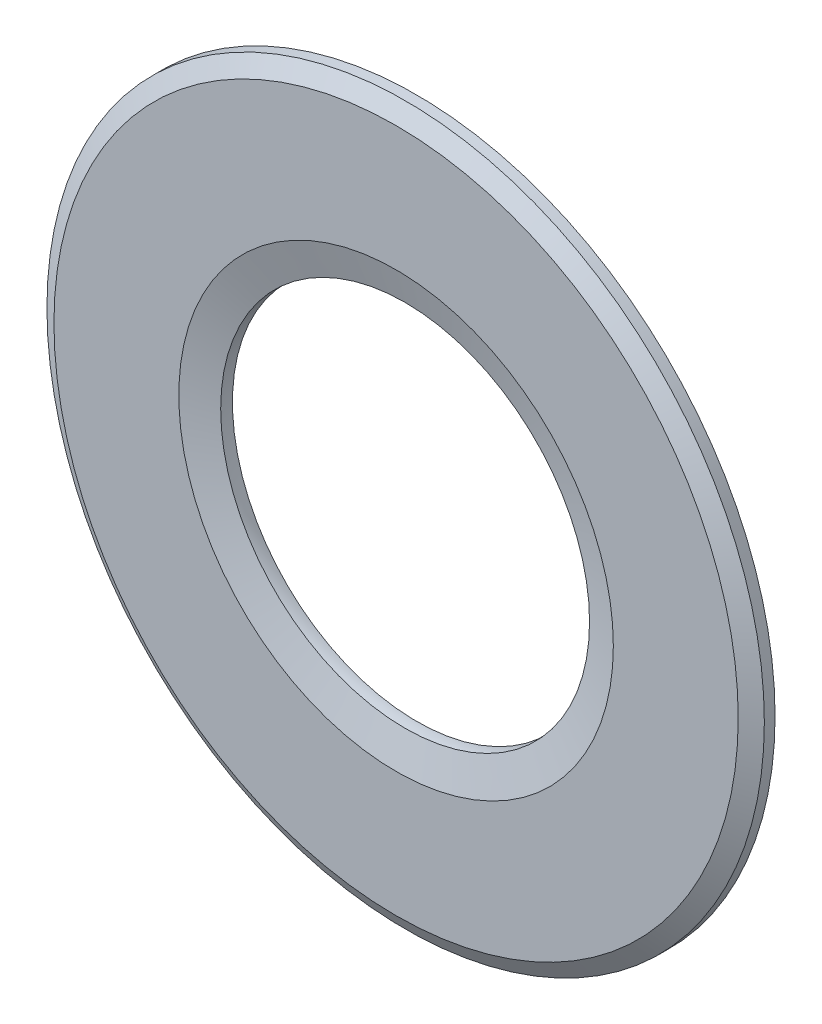
ISO-10303-21;
HEADER;
FILE_DESCRIPTION(('STEP AP214'),'2;1');
FILE_NAME('part.step','',(''),(''),'','','');
FILE_SCHEMA(('AUTOMOTIVE_DESIGN { 1 0 10303 214 1 1 1 1 }'));
ENDSEC;
DATA;
#1=APPLICATION_CONTEXT('core data for automotive mechanical design processes');
#2=APPLICATION_PROTOCOL_DEFINITION('international standard','automotive_design',2000,#1);
#3=PRODUCT_CONTEXT('',#1,'mechanical');
#4=PRODUCT('Part','Part','',(#3));
#5=PRODUCT_RELATED_PRODUCT_CATEGORY('part','',(#4));
#6=PRODUCT_DEFINITION_FORMATION('','',#4);
#7=PRODUCT_DEFINITION_CONTEXT('part definition',#1,'design');
#8=PRODUCT_DEFINITION('design','',#6,#7);
#9=PRODUCT_DEFINITION_SHAPE('','',#8);
#10=(LENGTH_UNIT() NAMED_UNIT(*) SI_UNIT(.MILLI.,.METRE.));
#11=(NAMED_UNIT(*) PLANE_ANGLE_UNIT() SI_UNIT($,.RADIAN.));
#12=(NAMED_UNIT(*) SI_UNIT($,.STERADIAN.) SOLID_ANGLE_UNIT());
#13=UNCERTAINTY_MEASURE_WITH_UNIT(LENGTH_MEASURE(1.E-05),#10,'distance_accuracy_value','');
#14=(GEOMETRIC_REPRESENTATION_CONTEXT(3) GLOBAL_UNCERTAINTY_ASSIGNED_CONTEXT((#13)) GLOBAL_UNIT_ASSIGNED_CONTEXT((#10,
#11,#12)) REPRESENTATION_CONTEXT('',''));
#15=CARTESIAN_POINT('',(0.,0.,0.));
#16=DIRECTION('',(0.,0.,1.));
#17=DIRECTION('',(1.,0.,0.));
#18=AXIS2_PLACEMENT_3D('',#15,#16,#17);
#19=CARTESIAN_POINT('',(0.,0.,0.396239999999998));
#20=DIRECTION('',(0.,0.,1.));
#21=DIRECTION('',(1.,0.,0.));
#22=AXIS2_PLACEMENT_3D('',#19,#20,#21);
#23=PLANE('',#22);
#24=CARTESIAN_POINT('',(0.,0.,0.396239999999998));
#25=DIRECTION('',(0.,0.,1.));
#26=DIRECTION('',(1.,0.,0.));
#27=AXIS2_PLACEMENT_3D('',#24,#25,#26);
#28=CIRCLE('',#27,5.76924391946965);
#29=CARTESIAN_POINT('',(5.76924391946965,0.,0.396239999999998));
#30=VERTEX_POINT('',#29);
#31=EDGE_CURVE('E10',#30,#30,#28,.F.);
#32=ORIENTED_EDGE('',*,*,#31,.T.);
#33=EDGE_LOOP('',(#32));
#34=FACE_BOUND('',#33,.T.);
#35=CARTESIAN_POINT('',(0.,0.,0.396239999999998));
#36=DIRECTION('',(0.,0.,1.));
#37=DIRECTION('',(1.,0.,0.));
#38=AXIS2_PLACEMENT_3D('',#35,#36,#37);
#39=CIRCLE('',#38,9.08505909487751);
#40=CARTESIAN_POINT('',(9.08505909487751,0.,0.396239999999998));
#41=VERTEX_POINT('',#40);
#42=EDGE_CURVE('E75',#41,#41,#39,.T.);
#43=ORIENTED_EDGE('',*,*,#42,.T.);
#44=EDGE_LOOP('',(#43));
#45=FACE_BOUND('',#44,.T.);
#46=ADVANCED_FACE('F49',(#34,#45),#23,.T.);
#47=CARTESIAN_POINT('',(0.,0.,0.396239999999998));
#48=DIRECTION('',(0.,0.,-1.));
#49=DIRECTION('',(-1.,0.,0.));
#50=AXIS2_PLACEMENT_3D('',#47,#48,#49);
#51=CYLINDRICAL_SURFACE('',#50,9.525);
#52=CARTESIAN_POINT('',(0.,0.,-0.142240000000001));
#53=DIRECTION('',(0.,0.,1.));
#54=DIRECTION('',(1.,0.,0.));
#55=AXIS2_PLACEMENT_3D('',#52,#53,#54);
#56=CIRCLE('',#55,9.525);
#57=CARTESIAN_POINT('',(9.525,0.,-0.142240000000001));
#58=VERTEX_POINT('',#57);
#59=EDGE_CURVE('E83',#58,#58,#56,.T.);
#60=ORIENTED_EDGE('',*,*,#59,.T.);
#61=EDGE_LOOP('',(#60));
#62=FACE_BOUND('',#61,.T.);
#63=CARTESIAN_POINT('',(0.,0.,0.14224));
#64=DIRECTION('',(0.,0.,1.));
#65=DIRECTION('',(1.,0.,0.));
#66=AXIS2_PLACEMENT_3D('',#63,#64,#65);
#67=CIRCLE('',#66,9.525);
#68=CARTESIAN_POINT('',(9.525,0.,0.14224));
#69=VERTEX_POINT('',#68);
#70=EDGE_CURVE('E87',#69,#69,#67,.F.);
#71=ORIENTED_EDGE('',*,*,#70,.T.);
#72=EDGE_LOOP('',(#71));
#73=FACE_BOUND('',#72,.T.);
#74=ADVANCED_FACE('F93',(#62,#73),#51,.T.);
#75=CARTESIAN_POINT('',(0.,0.,-0.396240000000002));
#76=DIRECTION('',(0.,0.,1.));
#77=DIRECTION('',(1.,0.,0.));
#78=AXIS2_PLACEMENT_3D('',#75,#76,#77);
#79=PLANE('',#78);
#80=CARTESIAN_POINT('',(0.,0.,-0.396240000000002));
#81=DIRECTION('',(0.,0.,1.));
#82=DIRECTION('',(1.,0.,0.));
#83=AXIS2_PLACEMENT_3D('',#80,#81,#82);
#84=CIRCLE('',#83,5.76924391946964);
#85=CARTESIAN_POINT('',(5.76924391946964,0.,-0.396240000000002));
#86=VERTEX_POINT('',#85);
#87=EDGE_CURVE('E69',#86,#86,#84,.T.);
#88=ORIENTED_EDGE('',*,*,#87,.T.);
#89=EDGE_LOOP('',(#88));
#90=FACE_BOUND('',#89,.T.);
#91=CARTESIAN_POINT('',(0.,0.,-0.396240000000002));
#92=DIRECTION('',(0.,0.,1.));
#93=DIRECTION('',(1.,0.,0.));
#94=AXIS2_PLACEMENT_3D('',#91,#92,#93);
#95=CIRCLE('',#94,9.0850590948775);
#96=CARTESIAN_POINT('',(9.0850590948775,0.,-0.396240000000002));
#97=VERTEX_POINT('',#96);
#98=EDGE_CURVE('E79',#97,#97,#95,.F.);
#99=ORIENTED_EDGE('',*,*,#98,.T.);
#100=EDGE_LOOP('',(#99));
#101=FACE_BOUND('',#100,.T.);
#102=ADVANCED_FACE('F108',(#90,#101),#79,.F.);
#103=CARTESIAN_POINT('',(0.,0.,-0.142240000000001));
#104=DIRECTION('',(0.,0.,1.));
#105=DIRECTION('',(1.,0.,0.));
#106=AXIS2_PLACEMENT_3D('',#103,#104,#105);
#107=CONICAL_SURFACE('',#106,9.525,1.0471975511966);
#108=ORIENTED_EDGE('',*,*,#98,.F.);
#109=EDGE_LOOP('',(#108));
#110=FACE_BOUND('',#109,.T.);
#111=ORIENTED_EDGE('',*,*,#59,.F.);
#112=EDGE_LOOP('',(#111));
#113=FACE_BOUND('',#112,.T.);
#114=ADVANCED_FACE('F99',(#110,#113),#107,.T.);
#115=CARTESIAN_POINT('',(0.,0.,0.396239999999998));
#116=DIRECTION('',(0.,0.,-1.));
#117=DIRECTION('',(-1.,0.,0.));
#118=AXIS2_PLACEMENT_3D('',#115,#116,#117);
#119=CONICAL_SURFACE('',#118,9.08505909487751,1.04719755119659);
#120=ORIENTED_EDGE('',*,*,#70,.F.);
#121=EDGE_LOOP('',(#120));
#122=FACE_BOUND('',#121,.T.);
#123=ORIENTED_EDGE('',*,*,#42,.F.);
#124=EDGE_LOOP('',(#123));
#125=FACE_BOUND('',#124,.T.);
#126=ADVANCED_FACE('F95',(#122,#125),#119,.T.);
#127=CARTESIAN_POINT('',(0.,0.,0.));
#128=DIRECTION('',(0.,0.,1.));
#129=DIRECTION('',(0.,-1.,0.));
#130=AXIS2_PLACEMENT_3D('',#127,#128,#129);
#131=TOROIDAL_SURFACE('',#130,6.46023599999999,1.57073599999999);
#132=CARTESIAN_POINT('',(0.,0.,-0.156252780697694));
#133=DIRECTION('',(0.,0.,1.));
#134=DIRECTION('',(1.,0.,0.));
#135=AXIS2_PLACEMENT_3D('',#132,#133,#134);
#136=CIRCLE('',#135,4.89729113525901);
#137=CARTESIAN_POINT('',(4.89729113525901,0.,-0.156252780697694));
#138=VERTEX_POINT('',#137);
#139=EDGE_CURVE('E57',#138,#138,#136,.F.);
#140=ORIENTED_EDGE('',*,*,#139,.T.);
#141=EDGE_LOOP('',(#140));
#142=FACE_BOUND('',#141,.T.);
#143=CARTESIAN_POINT('',(0.,0.,0.156252780697684));
#144=DIRECTION('',(0.,0.,-1.));
#145=DIRECTION('',(-1.,0.,0.));
#146=AXIS2_PLACEMENT_3D('',#143,#144,#145);
#147=CIRCLE('',#146,4.89729113525901);
#148=CARTESIAN_POINT('',(-4.89729113525901,0.,0.156252780697684));
#149=VERTEX_POINT('',#148);
#150=EDGE_CURVE('E63',#149,#149,#147,.F.);
#151=ORIENTED_EDGE('',*,*,#150,.T.);
#152=EDGE_LOOP('',(#151));
#153=FACE_BOUND('',#152,.T.);
#154=ADVANCED_FACE('F98',(#142,#153),#131,.T.);
#155=CARTESIAN_POINT('',(0.,0.,-0.396240000000002));
#156=DIRECTION('',(0.,0.,-1.));
#157=DIRECTION('',(-1.,0.,0.));
#158=AXIS2_PLACEMENT_3D('',#155,#156,#157);
#159=CONICAL_SURFACE('',#158,5.76924391946964,1.30221666762707);
#160=ORIENTED_EDGE('',*,*,#139,.F.);
#161=EDGE_LOOP('',(#160));
#162=FACE_BOUND('',#161,.T.);
#163=ORIENTED_EDGE('',*,*,#87,.F.);
#164=EDGE_LOOP('',(#163));
#165=FACE_BOUND('',#164,.T.);
#166=ADVANCED_FACE('F116',(#162,#165),#159,.F.);
#167=CARTESIAN_POINT('',(0.,0.,0.156252780697684));
#168=DIRECTION('',(0.,0.,1.));
#169=DIRECTION('',(1.,0.,0.));
#170=AXIS2_PLACEMENT_3D('',#167,#168,#169);
#171=CONICAL_SURFACE('',#170,4.89729113525901,1.30221666762707);
#172=ORIENTED_EDGE('',*,*,#31,.F.);
#173=EDGE_LOOP('',(#172));
#174=FACE_BOUND('',#173,.T.);
#175=ORIENTED_EDGE('',*,*,#150,.F.);
#176=EDGE_LOOP('',(#175));
#177=FACE_BOUND('',#176,.T.);
#178=ADVANCED_FACE('F51',(#174,#177),#171,.F.);
#179=CLOSED_SHELL('',(#46,#74,#102,#114,#126,#154,#166,#178));
#180=MANIFOLD_SOLID_BREP('B2',#179);
#181=ADVANCED_BREP_SHAPE_REPRESENTATION('',(#18,#180),#14);
#182=SHAPE_DEFINITION_REPRESENTATION(#9,#181);
ENDSEC;
END-ISO-10303-21;
